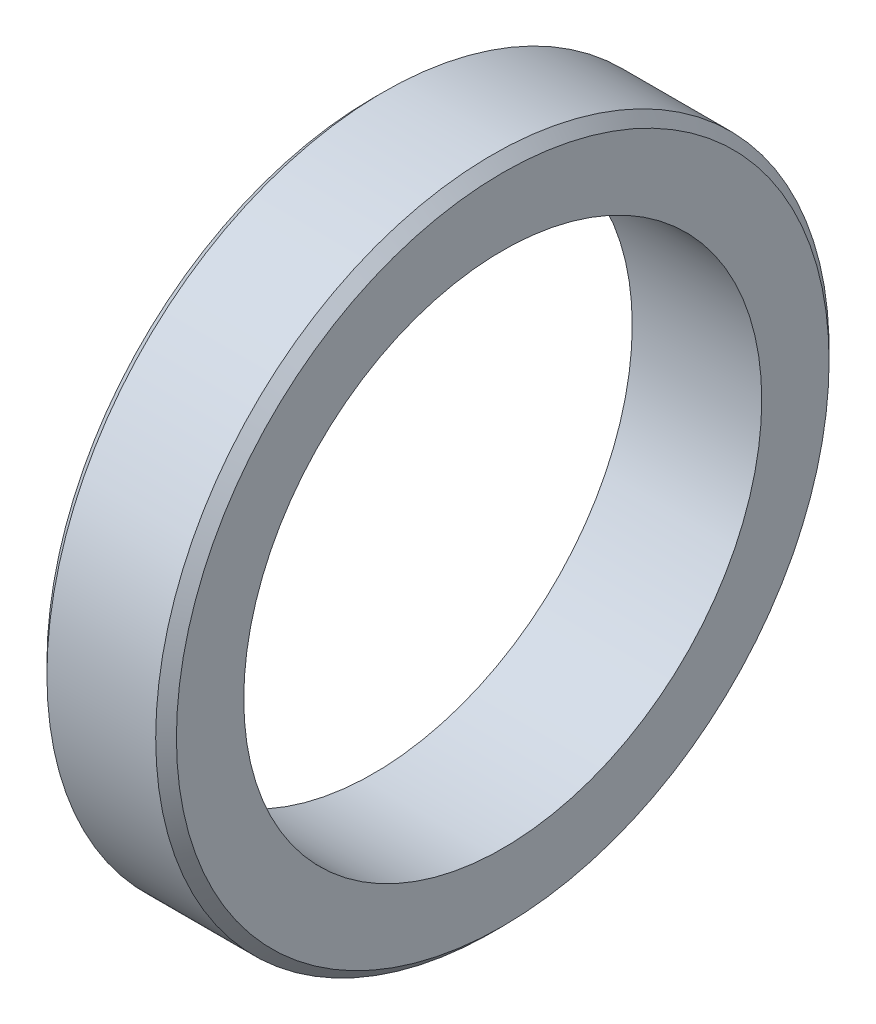
ISO-10303-21;
HEADER;
FILE_DESCRIPTION(('STEP AP214'),'2;1');
FILE_NAME('part.step','',(''),(''),'','','');
FILE_SCHEMA(('AUTOMOTIVE_DESIGN { 1 0 10303 214 1 1 1 1 }'));
ENDSEC;
DATA;
#1=APPLICATION_CONTEXT('core data for automotive mechanical design processes');
#2=APPLICATION_PROTOCOL_DEFINITION('international standard','automotive_design',2000,#1);
#3=PRODUCT_CONTEXT('',#1,'mechanical');
#4=PRODUCT('Part','Part','',(#3));
#5=PRODUCT_RELATED_PRODUCT_CATEGORY('part','',(#4));
#6=PRODUCT_DEFINITION_FORMATION('','',#4);
#7=PRODUCT_DEFINITION_CONTEXT('part definition',#1,'design');
#8=PRODUCT_DEFINITION('design','',#6,#7);
#9=PRODUCT_DEFINITION_SHAPE('','',#8);
#10=(LENGTH_UNIT() NAMED_UNIT(*) SI_UNIT(.MILLI.,.METRE.));
#11=(NAMED_UNIT(*) PLANE_ANGLE_UNIT() SI_UNIT($,.RADIAN.));
#12=(NAMED_UNIT(*) SI_UNIT($,.STERADIAN.) SOLID_ANGLE_UNIT());
#13=UNCERTAINTY_MEASURE_WITH_UNIT(LENGTH_MEASURE(1.E-05),#10,'distance_accuracy_value','');
#14=(GEOMETRIC_REPRESENTATION_CONTEXT(3) GLOBAL_UNCERTAINTY_ASSIGNED_CONTEXT((#13)) GLOBAL_UNIT_ASSIGNED_CONTEXT((#10,
#11,#12)) REPRESENTATION_CONTEXT('',''));
#15=CARTESIAN_POINT('',(0.,0.,0.));
#16=DIRECTION('',(0.,0.,1.));
#17=DIRECTION('',(1.,0.,0.));
#18=AXIS2_PLACEMENT_3D('',#15,#16,#17);
#19=CARTESIAN_POINT('',(0.,-6.47214093325049,-6.3));
#20=DIRECTION('',(-1.,0.,0.));
#21=DIRECTION('',(0.,0.,1.));
#22=AXIS2_PLACEMENT_3D('',#19,#20,#21);
#23=PLANE('',#22);
#24=CARTESIAN_POINT('',(0.,0.,0.));
#25=DIRECTION('',(-1.,0.,0.));
#26=DIRECTION('',(0.,0.,-1.));
#27=AXIS2_PLACEMENT_3D('',#24,#25,#26);
#28=CIRCLE('',#27,6.3);
#29=CARTESIAN_POINT('',(0.,0.,-6.3));
#30=VERTEX_POINT('',#29);
#31=EDGE_CURVE('E38',#30,#30,#28,.F.);
#32=ORIENTED_EDGE('',*,*,#31,.F.);
#33=EDGE_LOOP('',(#32));
#34=FACE_BOUND('',#33,.T.);
#35=CARTESIAN_POINT('',(0.,0.,0.));
#36=DIRECTION('',(1.,0.,0.));
#37=DIRECTION('',(0.,-1.42053901797114E-07,0.99999999999999));
#38=AXIS2_PLACEMENT_3D('',#35,#36,#37);
#39=CIRCLE('',#38,5.);
#40=CARTESIAN_POINT('',(0.,-7.10269508985571E-07,4.99999999999995));
#41=VERTEX_POINT('',#40);
#42=EDGE_CURVE('E35',#41,#41,#39,.T.);
#43=ORIENTED_EDGE('',*,*,#42,.T.);
#44=EDGE_LOOP('',(#43));
#45=FACE_BOUND('',#44,.T.);
#46=ADVANCED_FACE('F15',(#34,#45),#23,.T.);
#47=CARTESIAN_POINT('',(2.5,-6.47214093325049,6.3));
#48=DIRECTION('',(1.,0.,0.));
#49=DIRECTION('',(0.,0.,-1.));
#50=AXIS2_PLACEMENT_3D('',#47,#48,#49);
#51=PLANE('',#50);
#52=CARTESIAN_POINT('',(2.5,0.,0.));
#53=DIRECTION('',(1.,0.,0.));
#54=DIRECTION('',(0.,0.,1.));
#55=AXIS2_PLACEMENT_3D('',#52,#53,#54);
#56=CIRCLE('',#55,6.3);
#57=CARTESIAN_POINT('',(2.5,0.,6.3));
#58=VERTEX_POINT('',#57);
#59=EDGE_CURVE('E30',#58,#58,#56,.T.);
#60=ORIENTED_EDGE('',*,*,#59,.T.);
#61=EDGE_LOOP('',(#60));
#62=FACE_BOUND('',#61,.T.);
#63=CARTESIAN_POINT('',(2.5,0.,0.));
#64=DIRECTION('',(-1.,0.,0.));
#65=DIRECTION('',(0.,0.,-1.));
#66=AXIS2_PLACEMENT_3D('',#63,#64,#65);
#67=CIRCLE('',#66,5.);
#68=CARTESIAN_POINT('',(2.5,0.,-5.));
#69=VERTEX_POINT('',#68);
#70=EDGE_CURVE('E26',#69,#69,#67,.F.);
#71=ORIENTED_EDGE('',*,*,#70,.F.);
#72=EDGE_LOOP('',(#71));
#73=FACE_BOUND('',#72,.T.);
#74=ADVANCED_FACE('F46',(#62,#73),#51,.T.);
#75=CARTESIAN_POINT('',(2.5,0.,0.));
#76=DIRECTION('',(1.,0.,0.));
#77=DIRECTION('',(0.,0.,1.));
#78=AXIS2_PLACEMENT_3D('',#75,#76,#77);
#79=CYLINDRICAL_SURFACE('',#78,5.);
#80=ORIENTED_EDGE('',*,*,#70,.T.);
#81=EDGE_LOOP('',(#80));
#82=FACE_BOUND('',#81,.T.);
#83=ORIENTED_EDGE('',*,*,#42,.F.);
#84=EDGE_LOOP('',(#83));
#85=FACE_BOUND('',#84,.T.);
#86=ADVANCED_FACE('F50',(#82,#85),#79,.F.);
#87=CARTESIAN_POINT('',(2.3,0.,0.));
#88=DIRECTION('',(-1.,0.,0.));
#89=DIRECTION('',(0.,0.,-1.));
#90=AXIS2_PLACEMENT_3D('',#87,#88,#89);
#91=CONICAL_SURFACE('',#90,6.5,0.785398163397451);
#92=ORIENTED_EDGE('',*,*,#59,.F.);
#93=EDGE_LOOP('',(#92));
#94=FACE_BOUND('',#93,.T.);
#95=CARTESIAN_POINT('',(2.3,0.,0.));
#96=DIRECTION('',(1.,0.,0.));
#97=DIRECTION('',(0.,0.,1.));
#98=AXIS2_PLACEMENT_3D('',#95,#96,#97);
#99=CIRCLE('',#98,6.5);
#100=CARTESIAN_POINT('',(2.3,0.,6.5));
#101=VERTEX_POINT('',#100);
#102=EDGE_CURVE('E22',#101,#101,#99,.T.);
#103=ORIENTED_EDGE('',*,*,#102,.T.);
#104=EDGE_LOOP('',(#103));
#105=FACE_BOUND('',#104,.T.);
#106=ADVANCED_FACE('F52',(#94,#105),#91,.T.);
#107=CARTESIAN_POINT('',(2.5,0.,0.));
#108=DIRECTION('',(1.,0.,0.));
#109=DIRECTION('',(0.,0.,1.));
#110=AXIS2_PLACEMENT_3D('',#107,#108,#109);
#111=CYLINDRICAL_SURFACE('',#110,6.5);
#112=CARTESIAN_POINT('',(0.2,0.,0.));
#113=DIRECTION('',(1.,0.,0.));
#114=DIRECTION('',(0.,0.,1.));
#115=AXIS2_PLACEMENT_3D('',#112,#113,#114);
#116=CIRCLE('',#115,6.5);
#117=CARTESIAN_POINT('',(0.2,0.,6.5));
#118=VERTEX_POINT('',#117);
#119=EDGE_CURVE('E10',#118,#118,#116,.T.);
#120=ORIENTED_EDGE('',*,*,#119,.T.);
#121=EDGE_LOOP('',(#120));
#122=FACE_BOUND('',#121,.T.);
#123=ORIENTED_EDGE('',*,*,#102,.F.);
#124=EDGE_LOOP('',(#123));
#125=FACE_BOUND('',#124,.T.);
#126=ADVANCED_FACE('F60',(#122,#125),#111,.T.);
#127=CARTESIAN_POINT('',(0.2,0.,0.));
#128=DIRECTION('',(1.,0.,0.));
#129=DIRECTION('',(0.,0.,1.));
#130=AXIS2_PLACEMENT_3D('',#127,#128,#129);
#131=CONICAL_SURFACE('',#130,6.5,0.785398163397446);
#132=ORIENTED_EDGE('',*,*,#31,.T.);
#133=EDGE_LOOP('',(#132));
#134=FACE_BOUND('',#133,.T.);
#135=ORIENTED_EDGE('',*,*,#119,.F.);
#136=EDGE_LOOP('',(#135));
#137=FACE_BOUND('',#136,.T.);
#138=ADVANCED_FACE('F17',(#134,#137),#131,.T.);
#139=CLOSED_SHELL('',(#46,#74,#86,#106,#126,#138));
#140=MANIFOLD_SOLID_BREP('B1',#139);
#141=ADVANCED_BREP_SHAPE_REPRESENTATION('',(#18,#140),#14);
#142=SHAPE_DEFINITION_REPRESENTATION(#9,#141);
ENDSEC;
END-ISO-10303-21;
